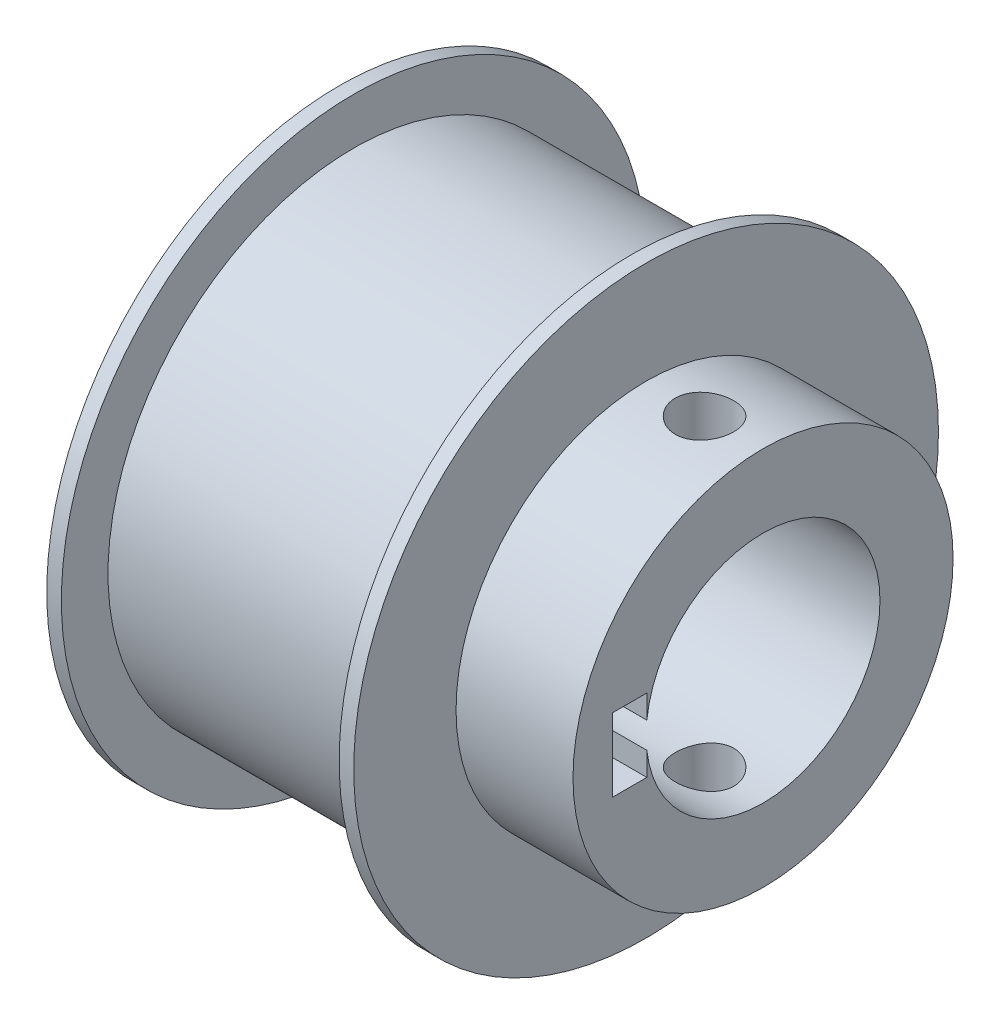
ISO-10303-21;
HEADER;
FILE_DESCRIPTION(('STEP AP214'),'2;1');
FILE_NAME('part.step','',(''),(''),'','','');
FILE_SCHEMA(('AUTOMOTIVE_DESIGN { 1 0 10303 214 1 1 1 1 }'));
ENDSEC;
DATA;
#1=APPLICATION_CONTEXT('core data for automotive mechanical design processes');
#2=APPLICATION_PROTOCOL_DEFINITION('international standard','automotive_design',2000,#1);
#3=PRODUCT_CONTEXT('',#1,'mechanical');
#4=PRODUCT('Part','Part','',(#3));
#5=PRODUCT_RELATED_PRODUCT_CATEGORY('part','',(#4));
#6=PRODUCT_DEFINITION_FORMATION('','',#4);
#7=PRODUCT_DEFINITION_CONTEXT('part definition',#1,'design');
#8=PRODUCT_DEFINITION('design','',#6,#7);
#9=PRODUCT_DEFINITION_SHAPE('','',#8);
#10=(LENGTH_UNIT() NAMED_UNIT(*) SI_UNIT(.MILLI.,.METRE.));
#11=(NAMED_UNIT(*) PLANE_ANGLE_UNIT() SI_UNIT($,.RADIAN.));
#12=(NAMED_UNIT(*) SI_UNIT($,.STERADIAN.) SOLID_ANGLE_UNIT());
#13=UNCERTAINTY_MEASURE_WITH_UNIT(LENGTH_MEASURE(1.E-05),#10,'distance_accuracy_value','');
#14=(GEOMETRIC_REPRESENTATION_CONTEXT(3) GLOBAL_UNCERTAINTY_ASSIGNED_CONTEXT((#13)) GLOBAL_UNIT_ASSIGNED_CONTEXT((#10,
#11,#12)) REPRESENTATION_CONTEXT('',''));
#15=CARTESIAN_POINT('',(0.,0.,0.));
#16=DIRECTION('',(0.,0.,1.));
#17=DIRECTION('',(1.,0.,0.));
#18=AXIS2_PLACEMENT_3D('',#15,#16,#17);
#19=CARTESIAN_POINT('',(0.014,17.514,27.964));
#20=DIRECTION('',(0.,0.,1.));
#21=DIRECTION('',(1.,0.,0.));
#22=AXIS2_PLACEMENT_3D('',#19,#20,#21);
#23=PLANE('',#22);
#24=DIRECTION('',(0.,1.,0.));
#25=VECTOR('',#24,1.);
#26=CARTESIAN_POINT('',(29.014,20.014,27.964));
#27=LINE('',#26,#25);
#28=CARTESIAN_POINT('',(29.014,19.1209714450257,27.964));
#29=VERTEX_POINT('',#28);
#30=CARTESIAN_POINT('',(29.014,17.514,27.964));
#31=VERTEX_POINT('',#30);
#32=EDGE_CURVE('E79',#29,#31,#27,.F.);
#33=ORIENTED_EDGE('',*,*,#32,.F.);
#34=DIRECTION('',(1.,0.,0.));
#35=VECTOR('',#34,1.);
#36=CARTESIAN_POINT('',(0.014,19.120971445025,27.964));
#37=LINE('',#36,#35);
#38=CARTESIAN_POINT('',(0.014,19.1209714450252,27.964));
#39=VERTEX_POINT('',#38);
#40=EDGE_CURVE('E58',#29,#39,#37,.F.);
#41=ORIENTED_EDGE('',*,*,#40,.T.);
#42=DIRECTION('',(0.,1.,0.));
#43=VECTOR('',#42,1.);
#44=CARTESIAN_POINT('',(0.014,17.514,27.964));
#45=LINE('',#44,#43);
#46=CARTESIAN_POINT('',(0.014,17.514,27.964));
#47=VERTEX_POINT('',#46);
#48=EDGE_CURVE('E97',#39,#47,#45,.F.);
#49=ORIENTED_EDGE('',*,*,#48,.T.);
#50=DIRECTION('',(1.,0.,0.));
#51=VECTOR('',#50,1.);
#52=CARTESIAN_POINT('',(0.014,17.514,27.964));
#53=LINE('',#52,#51);
#54=EDGE_CURVE('E114',#31,#47,#53,.F.);
#55=ORIENTED_EDGE('',*,*,#54,.F.);
#56=EDGE_LOOP('',(#33,#41,#49,#55));
#57=FACE_BOUND('',#56,.T.);
#58=ADVANCED_FACE('F16',(#57),#23,.T.);
#59=CARTESIAN_POINT('',(0.014,17.514,27.964));
#60=DIRECTION('',(0.,0.,1.));
#61=DIRECTION('',(1.,0.,0.));
#62=AXIS2_PLACEMENT_3D('',#59,#60,#61);
#63=PLANE('',#62);
#64=DIRECTION('',(0.,1.,0.));
#65=VECTOR('',#64,1.);
#66=CARTESIAN_POINT('',(29.014,20.014,27.964));
#67=LINE('',#66,#65);
#68=CARTESIAN_POINT('',(29.014,22.514,27.964));
#69=VERTEX_POINT('',#68);
#70=CARTESIAN_POINT('',(29.014,20.9070285549748,27.964));
#71=VERTEX_POINT('',#70);
#72=EDGE_CURVE('E70',#69,#71,#67,.F.);
#73=ORIENTED_EDGE('',*,*,#72,.F.);
#74=DIRECTION('',(1.,0.,0.));
#75=VECTOR('',#74,1.);
#76=CARTESIAN_POINT('',(0.014,22.514,27.964));
#77=LINE('',#76,#75);
#78=CARTESIAN_POINT('',(0.014,22.514,27.964));
#79=VERTEX_POINT('',#78);
#80=EDGE_CURVE('E109',#69,#79,#77,.F.);
#81=ORIENTED_EDGE('',*,*,#80,.T.);
#82=DIRECTION('',(0.,1.,0.));
#83=VECTOR('',#82,1.);
#84=CARTESIAN_POINT('',(0.014,17.514,27.964));
#85=LINE('',#84,#83);
#86=CARTESIAN_POINT('',(0.014,20.9070285549738,27.9640000000001));
#87=VERTEX_POINT('',#86);
#88=EDGE_CURVE('E35',#79,#87,#85,.F.);
#89=ORIENTED_EDGE('',*,*,#88,.T.);
#90=DIRECTION('',(1.,0.,0.));
#91=VECTOR('',#90,1.);
#92=CARTESIAN_POINT('',(0.014,20.907028554973,27.9640000000002));
#93=LINE('',#92,#91);
#94=EDGE_CURVE('E66',#87,#71,#93,.T.);
#95=ORIENTED_EDGE('',*,*,#94,.T.);
#96=EDGE_LOOP('',(#73,#81,#89,#95));
#97=FACE_BOUND('',#96,.T.);
#98=ADVANCED_FACE('F67',(#97),#63,.T.);
#99=CARTESIAN_POINT('',(29.014,20.014,20.014));
#100=DIRECTION('',(1.,0.,0.));
#101=DIRECTION('',(0.,0.,-1.));
#102=AXIS2_PLACEMENT_3D('',#99,#100,#101);
#103=PLANE('',#102);
#104=DIRECTION('',(0.,0.,1.));
#105=VECTOR('',#104,1.);
#106=CARTESIAN_POINT('',(29.014,22.514,27.964));
#107=LINE('',#106,#105);
#108=CARTESIAN_POINT('',(29.014,22.514,30.314));
#109=VERTEX_POINT('',#108);
#110=EDGE_CURVE('E84',#109,#69,#107,.F.);
#111=ORIENTED_EDGE('',*,*,#110,.T.);
#112=ORIENTED_EDGE('',*,*,#72,.T.);
#113=CARTESIAN_POINT('',(29.014,20.014,20.014));
#114=DIRECTION('',(1.,0.,0.));
#115=DIRECTION('',(0.,0.,-1.));
#116=AXIS2_PLACEMENT_3D('',#113,#114,#115);
#117=CIRCLE('',#116,8.);
#118=EDGE_CURVE('E20',#71,#29,#117,.F.);
#119=ORIENTED_EDGE('',*,*,#118,.T.);
#120=ORIENTED_EDGE('',*,*,#32,.T.);
#121=DIRECTION('',(0.,0.,1.));
#122=VECTOR('',#121,1.);
#123=CARTESIAN_POINT('',(29.014,17.514,27.964));
#124=LINE('',#123,#122);
#125=CARTESIAN_POINT('',(29.014,17.514,30.314));
#126=VERTEX_POINT('',#125);
#127=EDGE_CURVE('E117',#126,#31,#124,.F.);
#128=ORIENTED_EDGE('',*,*,#127,.F.);
#129=DIRECTION('',(0.,1.,0.));
#130=VECTOR('',#129,1.);
#131=CARTESIAN_POINT('',(29.014,17.514,30.314));
#132=LINE('',#131,#130);
#133=EDGE_CURVE('E111',#126,#109,#132,.T.);
#134=ORIENTED_EDGE('',*,*,#133,.T.);
#135=EDGE_LOOP('',(#111,#112,#119,#120,#128,#134));
#136=FACE_BOUND('',#135,.T.);
#137=CARTESIAN_POINT('',(29.014,20.014,20.014));
#138=DIRECTION('',(1.,0.,0.));
#139=DIRECTION('',(0.,0.,-1.));
#140=AXIS2_PLACEMENT_3D('',#137,#138,#139);
#141=CIRCLE('',#140,13.);
#142=CARTESIAN_POINT('',(29.014,20.014,7.014));
#143=VERTEX_POINT('',#142);
#144=EDGE_CURVE('E105',#143,#143,#141,.F.);
#145=ORIENTED_EDGE('',*,*,#144,.F.);
#146=EDGE_LOOP('',(#145));
#147=FACE_BOUND('',#146,.T.);
#148=ADVANCED_FACE('F80',(#136,#147),#103,.T.);
#149=CARTESIAN_POINT('',(25.014,33.014,20.014));
#150=DIRECTION('',(0.,-1.,0.));
#151=DIRECTION('',(0.,0.,-1.));
#152=AXIS2_PLACEMENT_3D('',#149,#150,#151);
#153=CYLINDRICAL_SURFACE('',#152,2.);
#154=CARTESIAN_POINT('',(27.0140000416667,33.0140000416667,20.014));
#155=CARTESIAN_POINT('',(27.0139950115,33.0139981262623,20.1255273037603));
#156=CARTESIAN_POINT('',(27.0046319758743,33.0125486004977,20.2371981854701));
#157=CARTESIAN_POINT('',(26.967416237804,33.0069022317644,20.4574980159759));
#158=CARTESIAN_POINT('',(26.9395256947534,33.0026997664324,20.5661202640384));
#159=CARTESIAN_POINT('',(26.8661068542264,32.9920194652457,20.7769813903583));
#160=CARTESIAN_POINT('',(26.8205994740745,32.9855443286916,20.8792276725657));
#161=CARTESIAN_POINT('',(26.713285753223,32.9710351005288,21.0745887182655));
#162=CARTESIAN_POINT('',(26.6514857217176,32.9630016126962,21.1677069973945));
#163=CARTESIAN_POINT('',(26.5127883361127,32.9461926198241,21.3429902654713));
#164=CARTESIAN_POINT('',(26.435782127367,32.937412040992,21.4250686497853));
#165=CARTESIAN_POINT('',(26.2690890889964,32.9201376942507,21.5751965623571));
#166=CARTESIAN_POINT('',(26.1794008686756,32.9116439579231,21.6432445500419));
#167=CARTESIAN_POINT('',(25.989317860327,32.8958571349,21.7637084897802));
#168=CARTESIAN_POINT('',(25.8888700546251,32.8885704907595,21.8160417018071));
#169=CARTESIAN_POINT('',(25.6804801816044,32.8760913084053,21.903061039858));
#170=CARTESIAN_POINT('',(25.5725386098794,32.8708986318633,21.9377483316181));
#171=CARTESIAN_POINT('',(25.3531243035705,32.8632445609469,21.9882257685563));
#172=CARTESIAN_POINT('',(25.2416860226075,32.860762004246,22.004162407963));
#173=CARTESIAN_POINT('',(25.0176912618173,32.8587450648571,22.0171400539628));
#174=CARTESIAN_POINT('',(24.9051348479891,32.8592105091805,22.0141821692862));
#175=CARTESIAN_POINT('',(24.6831373627152,32.8630176306083,21.9895744135792));
#176=CARTESIAN_POINT('',(24.5736776585285,32.8663341274423,21.968088178316));
#177=CARTESIAN_POINT('',(24.3599347996823,32.8754303598459,21.9072896181141));
#178=CARTESIAN_POINT('',(24.2556518420732,32.8812101891009,21.8679766151845));
#179=CARTESIAN_POINT('',(24.0547243508733,32.8946097431793,21.7724697411699));
#180=CARTESIAN_POINT('',(23.9581134054256,32.90223702355,21.716206311179));
#181=CARTESIAN_POINT('',(23.7756494776341,32.9184658973521,21.5884499190713));
#182=CARTESIAN_POINT('',(23.6897963936178,32.9270674815739,21.5169571009046));
#183=CARTESIAN_POINT('',(23.530343506167,32.9443857977198,21.3598888034238));
#184=CARTESIAN_POINT('',(23.4568796503506,32.9531028003158,21.2741752905057));
#185=CARTESIAN_POINT('',(23.3253249632562,32.9695913990116,21.0915185108495));
#186=CARTESIAN_POINT('',(23.2672410610363,32.9773625681403,20.994570210737));
#187=CARTESIAN_POINT('',(23.1680921975812,32.9910933700786,20.7920501961293));
#188=CARTESIAN_POINT('',(23.1270520185102,32.9970503616806,20.686466189973));
#189=CARTESIAN_POINT('',(23.0634076189869,33.0064518685837,20.4699327276271));
#190=CARTESIAN_POINT('',(23.0407644786679,33.0099016862971,20.3589951271221));
#191=CARTESIAN_POINT('',(23.0230866769247,33.0126047645657,20.2083905467064));
#192=CARTESIAN_POINT('',(23.0196818598663,33.013126880972,20.1695973515553));
#193=CARTESIAN_POINT('',(23.0151376366844,33.0138248389177,20.0918752739758));
#194=CARTESIAN_POINT('',(23.0139982320686,33.0140006802267,20.0529463914571));
#195=CARTESIAN_POINT('',(23.0140050626674,33.0139980520956,19.9024726930908));
#196=CARTESIAN_POINT('',(23.0233680446544,33.012548580508,19.7908018082157));
#197=CARTESIAN_POINT('',(23.0605837437676,33.00690225147,19.5705019776749));
#198=CARTESIAN_POINT('',(23.0884743009788,33.0026997716138,19.4618797326302));
#199=CARTESIAN_POINT('',(23.1618931509685,32.9920194599349,19.2510186102919));
#200=CARTESIAN_POINT('',(23.2074005266429,32.9855443273652,19.1487723291194));
#201=CARTESIAN_POINT('',(23.314714244477,32.9710351020687,18.9534112829315));
#202=CARTESIAN_POINT('',(23.3765142778538,32.9630016130804,18.8602930025097));
#203=CARTESIAN_POINT('',(23.515211665704,32.9461926192693,18.6850097328749));
#204=CARTESIAN_POINT('',(23.5922178746924,32.9374120406695,18.6029313481988));
#205=CARTESIAN_POINT('',(23.7589109131149,32.920137694141,18.4528034359026));
#206=CARTESIAN_POINT('',(23.8485991331078,32.9116439577906,18.3847554487034));
#207=CARTESIAN_POINT('',(24.0386821409298,32.8958571347799,18.2642915095485));
#208=CARTESIAN_POINT('',(24.1391299464698,32.8885704906793,18.2119582976774));
#209=CARTESIAN_POINT('',(24.3475198195195,32.8760913083526,18.1249389597309));
#210=CARTESIAN_POINT('',(24.4554613914616,32.8708986318052,18.0902516679804));
#211=CARTESIAN_POINT('',(24.6748756980311,32.8632445609022,18.0397742311675));
#212=CARTESIAN_POINT('',(24.7863139790313,32.8607620042161,18.0238375918482));
#213=CARTESIAN_POINT('',(25.0103087398253,32.8587450648575,18.0108599460359));
#214=CARTESIAN_POINT('',(25.1228651536195,32.8592105091949,18.0138178308031));
#215=CARTESIAN_POINT('',(25.3448626389302,32.8630176306496,18.0384255866914));
#216=CARTESIAN_POINT('',(25.4543223431857,32.8663341274997,18.0599118220655));
#217=CARTESIAN_POINT('',(25.6680652019752,32.8754303599321,18.1207103824635));
#218=CARTESIAN_POINT('',(25.7723481594673,32.8812101891958,18.1600233854497));
#219=CARTESIAN_POINT('',(25.973275650203,32.8946097432589,18.2555302594402));
#220=CARTESIAN_POINT('',(26.069886595321,32.9022370236015,18.3117936893139));
#221=CARTESIAN_POINT('',(26.2523505231048,32.9184658974327,18.4395500814758));
#222=CARTESIAN_POINT('',(26.3382036073787,32.9270674817176,18.5110428999051));
#223=CARTESIAN_POINT('',(26.4976564955004,32.9443857978651,18.6681111983923));
#224=CARTESIAN_POINT('',(26.5711203516597,32.953102800398,18.7538247121238));
#225=CARTESIAN_POINT('',(26.7026750387229,32.9695913994295,18.93648149206));
#226=CARTESIAN_POINT('',(26.7607589408178,32.9773625689727,19.0334297914585));
#227=CARTESIAN_POINT('',(26.8599078017029,32.9910933694031,19.2359498040026));
#228=CARTESIAN_POINT('',(26.9009479784176,32.9970503590892,19.3415338087636));
#229=CARTESIAN_POINT('',(26.9645923832684,33.0064518710499,19.5580672708773));
#230=CARTESIAN_POINT('',(26.987235530762,33.0099016956512,19.6690048726953));
#231=CARTESIAN_POINT('',(27.0049133200377,33.0126047613673,19.8196094552374));
#232=CARTESIAN_POINT('',(27.0083181319272,33.0131268726133,19.8584026508055));
#233=CARTESIAN_POINT('',(27.0128623717686,33.0138248473142,19.9361247278781));
#234=CARTESIAN_POINT('',(27.0140017982485,33.014000710544,19.9750536094708));
#235=CARTESIAN_POINT('',(27.0140000416667,33.0140000416667,20.014));
#236=B_SPLINE_CURVE_WITH_KNOTS('',3,(#154,#155,#156,#157,#158,#159,#160,#161,#162,#163,#164,
#165,#166,#167,#168,#169,#170,#171,#172,#173,#174,#175,#176,#177,#178,#179,#180,#181,#182,#183,
#184,#185,#186,#187,#188,#189,#190,#191,#192,#193,#194,#195,#196,#197,#198,#199,#200,#201,#202,
#203,#204,#205,#206,#207,#208,#209,#210,#211,#212,#213,#214,#215,#216,#217,#218,#219,#220,#221,
#222,#223,#224,#225,#226,#227,#228,#229,#230,#231,#232,#233,#234,#235),.UNSPECIFIED.,.T.,.F.,(4,
2,2,2,2,2,2,2,2,2,2,2,2,2,2,2,2,2,2,2,2,2,2,2,2,2,2,2,2,2,2,2,2,2,2,2,2,2,2,2,4),(0.,
0.334433336554248,0.669551828931188,1.00427363329828,1.3388660093271,1.67594660617867,
2.01306419564025,2.35192682002691,2.69076705534331,3.02694205620429,3.36309733050424,
3.69631385696467,4.02954305744271,4.36415878991411,4.69877135969541,5.03684548499304,
5.37507166307866,5.71378792628709,6.05178573847991,6.1685729496577,6.28536023855719,
6.61979357948793,6.95491206426401,7.28963386478933,7.62422624544979,7.96130684413231,
8.29842443177513,8.63728705557362,8.97612729147528,9.31230229241224,9.64845756661777,
9.98167409334363,10.3149032935513,10.6495190250287,10.98413159582,11.3222057238526,
11.6604318992155,11.9991481578886,12.3371459746061,12.4539331866114,12.5707204744977),.UNSPECIFIED.);
#237=CARTESIAN_POINT('',(27.0140000416667,33.0140000416667,20.014));
#238=VERTEX_POINT('',#237);
#239=EDGE_CURVE('E163',#238,#238,#236,.T.);
#240=ORIENTED_EDGE('',*,*,#239,.F.);
#241=EDGE_LOOP('',(#240));
#242=FACE_BOUND('',#241,.T.);
#243=CARTESIAN_POINT('',(27.014,28.014,20.014));
#244=CARTESIAN_POINT('',(27.0139943551092,28.0139967232233,19.9036265058065));
#245=CARTESIAN_POINT('',(27.0048228022313,28.0116904338893,19.7931232140391));
#246=CARTESIAN_POINT('',(26.968403069722,28.0027040073668,19.5751852357951));
#247=CARTESIAN_POINT('',(26.9411208560528,27.9960156355606,19.4677567247731));
#248=CARTESIAN_POINT('',(26.8694088873548,27.9790070093234,19.2592940848464));
#249=CARTESIAN_POINT('',(26.8250085240754,27.968692982781,19.1582493392886));
#250=CARTESIAN_POINT('',(26.7204072322132,27.9455341840969,18.965075781654));
#251=CARTESIAN_POINT('',(26.6602103883455,27.9326900664097,18.8729446730716));
#252=CARTESIAN_POINT('',(26.5244008259397,27.905565884715,18.6982668233512));
#253=CARTESIAN_POINT('',(26.4485220705619,27.891263546403,18.6159303508182));
#254=CARTESIAN_POINT('',(26.2840685910166,27.862982371055,18.4650051174588));
#255=CARTESIAN_POINT('',(26.1954917412094,27.8490035886375,18.396418662982));
#256=CARTESIAN_POINT('',(26.0065393237289,27.8227302901337,18.2739643886937));
#257=CARTESIAN_POINT('',(25.9060082417738,27.8104638306106,18.2203299667376));
#258=CARTESIAN_POINT('',(25.6970012748183,27.7893265285306,18.1308038371054));
#259=CARTESIAN_POINT('',(25.588526725028,27.7804551168569,18.0949091553972));
#260=CARTESIAN_POINT('',(25.3690087356128,27.7673396932728,18.0425935681706));
#261=CARTESIAN_POINT('',(25.2580602740414,27.7630065518464,18.0257969957999));
#262=CARTESIAN_POINT('',(25.0348420445204,27.7591914988918,18.0109842977197));
#263=CARTESIAN_POINT('',(24.9225724928555,27.759708804003,18.0129651394058));
#264=CARTESIAN_POINT('',(24.7027792808956,27.7654560641484,18.0353512620788));
#265=CARTESIAN_POINT('',(24.5952065484016,27.7705714728833,18.0553087406261));
#266=CARTESIAN_POINT('',(24.3849859446402,27.7847560689353,18.1123675127474));
#267=CARTESIAN_POINT('',(24.2823384573448,27.7938255639587,18.1494701405674));
#268=CARTESIAN_POINT('',(24.083679299873,27.8150018759886,18.2401488629789));
#269=CARTESIAN_POINT('',(23.9877453394808,27.8271385158416,18.293887946315));
#270=CARTESIAN_POINT('',(23.8061026143021,27.8530637372651,18.4161963472254));
#271=CARTESIAN_POINT('',(23.72039495625,27.866852497312,18.48476726771));
#272=CARTESIAN_POINT('',(23.5590782019942,27.8950088932488,18.6370996069856));
#273=CARTESIAN_POINT('',(23.483824192049,27.9093818591952,18.721236494027));
#274=CARTESIAN_POINT('',(23.348395671491,27.936740996237,18.9011473024731));
#275=CARTESIAN_POINT('',(23.2882276476748,27.9497265693972,18.9969262036146));
#276=CARTESIAN_POINT('',(23.1845501103733,27.9729141964943,19.1979357541348));
#277=CARTESIAN_POINT('',(23.1411114496638,27.9831043599643,19.303204323475));
#278=CARTESIAN_POINT('',(23.0727276118664,27.9994505931434,19.5197328167494));
#279=CARTESIAN_POINT('',(23.0477439144675,28.0056150623863,19.6309797383203));
#280=CARTESIAN_POINT('',(23.0262606388046,28.0109422052241,19.7882853685857));
#281=CARTESIAN_POINT('',(23.0216673432076,28.0120860551192,19.8332913577974));
#282=CARTESIAN_POINT('',(23.0155358630925,28.0136156250803,19.923524292738));
#283=CARTESIAN_POINT('',(23.0139976858183,28.0140013433487,19.9687512389906));
#284=CARTESIAN_POINT('',(23.0140056448908,28.0139967232233,20.1243734941935));
#285=CARTESIAN_POINT('',(23.0231771977687,28.0116904338893,20.2348767859609));
#286=CARTESIAN_POINT('',(23.059596930278,28.0027040073668,20.4528147642049));
#287=CARTESIAN_POINT('',(23.0868791439473,27.9960156355606,20.560243275227));
#288=CARTESIAN_POINT('',(23.1585911126452,27.9790070093234,20.7687059151536));
#289=CARTESIAN_POINT('',(23.2029914759246,27.968692982781,20.8697506607114));
#290=CARTESIAN_POINT('',(23.3075927677868,27.9455341840969,21.062924218346));
#291=CARTESIAN_POINT('',(23.3677896116545,27.9326900664097,21.1550553269284));
#292=CARTESIAN_POINT('',(23.5035991740603,27.905565884715,21.3297331766488));
#293=CARTESIAN_POINT('',(23.5794779294381,27.891263546403,21.4120696491818));
#294=CARTESIAN_POINT('',(23.7439314089834,27.862982371055,21.5629948825412));
#295=CARTESIAN_POINT('',(23.8325082587906,27.8490035886375,21.631581337018));
#296=CARTESIAN_POINT('',(24.0214606762712,27.8227302901337,21.7540356113063));
#297=CARTESIAN_POINT('',(24.1219917582263,27.8104638306106,21.8076700332624));
#298=CARTESIAN_POINT('',(24.3309987251817,27.7893265285306,21.8971961628946));
#299=CARTESIAN_POINT('',(24.4394732749721,27.7804551168569,21.9330908446028));
#300=CARTESIAN_POINT('',(24.6589912643872,27.7673396932728,21.9854064318294));
#301=CARTESIAN_POINT('',(24.7699397259586,27.7630065518464,22.0022030042001));
#302=CARTESIAN_POINT('',(24.9931579554796,27.7591914988918,22.0170157022803));
#303=CARTESIAN_POINT('',(25.1054275071445,27.759708804003,22.0150348605942));
#304=CARTESIAN_POINT('',(25.3252207191044,27.7654560641484,21.9926487379212));
#305=CARTESIAN_POINT('',(25.4327934515984,27.7705714728833,21.9726912593738));
#306=CARTESIAN_POINT('',(25.6430140553598,27.7847560689353,21.9156324872526));
#307=CARTESIAN_POINT('',(25.7456615426552,27.7938255639587,21.8785298594326));
#308=CARTESIAN_POINT('',(25.944320700127,27.8150018759886,21.7878511370211));
#309=CARTESIAN_POINT('',(26.0402546605192,27.8271385158416,21.734112053685));
#310=CARTESIAN_POINT('',(26.2218973856979,27.8530637372651,21.6118036527746));
#311=CARTESIAN_POINT('',(26.3076050437501,27.866852497312,21.54323273229));
#312=CARTESIAN_POINT('',(26.4689217980058,27.8950088932488,21.3909003930144));
#313=CARTESIAN_POINT('',(26.544175807951,27.9093818591952,21.306763505973));
#314=CARTESIAN_POINT('',(26.679604328509,27.936740996237,21.1268526975269));
#315=CARTESIAN_POINT('',(26.7397723523252,27.9497265693972,21.0310737963854));
#316=CARTESIAN_POINT('',(26.8434498896267,27.9729141964943,20.8300642458652));
#317=CARTESIAN_POINT('',(26.8868885503362,27.9831043599643,20.724795676525));
#318=CARTESIAN_POINT('',(26.9552723881336,27.9994505931434,20.5082671832506));
#319=CARTESIAN_POINT('',(26.9802560855325,28.0056150623863,20.3970202616797));
#320=CARTESIAN_POINT('',(27.0017393611955,28.0109422052241,20.2397146314143));
#321=CARTESIAN_POINT('',(27.0063326567925,28.0120860551192,20.1947086422026));
#322=CARTESIAN_POINT('',(27.0124641369075,28.0136156250803,20.104475707262));
#323=CARTESIAN_POINT('',(27.0140023141817,28.0140013433487,20.0592487610094));
#324=CARTESIAN_POINT('',(27.014,28.014,20.014));
#325=B_SPLINE_CURVE_WITH_KNOTS('',3,(#243,#244,#245,#246,#247,#248,#249,#250,#251,#252,#253,
#254,#255,#256,#257,#258,#259,#260,#261,#262,#263,#264,#265,#266,#267,#268,#269,#270,#271,#272,
#273,#274,#275,#276,#277,#278,#279,#280,#281,#282,#283,#284,#285,#286,#287,#288,#289,#290,#291,
#292,#293,#294,#295,#296,#297,#298,#299,#300,#301,#302,#303,#304,#305,#306,#307,#308,#309,#310,
#311,#312,#313,#314,#315,#316,#317,#318,#319,#320,#321,#322,#323,#324),.UNSPECIFIED.,.T.,.F.,(4,
2,2,2,2,2,2,2,2,2,2,2,2,2,2,2,2,2,2,2,2,2,2,2,2,2,2,2,2,2,2,2,2,2,2,2,2,2,2,2,4),(0.,
0.330946983045439,0.662517657801357,0.993521545220029,1.32443992457115,1.66151658222464,
1.99864973197669,2.34078329803452,2.68285948660786,3.01808373561038,3.35325384589237,
3.68029888738367,4.00736938400806,4.33775143805342,4.66816921509436,5.00795227856435,
5.34788119516374,5.68923436048329,6.02987300392473,6.16554783732439,6.30122299241518,
6.63216997546062,6.96374065021654,7.29474453763522,7.62566291698633,7.96273957463983,
8.29987272439187,8.64200629044971,8.98408247902305,9.31930672802557,9.65447683830756,
9.98152187979886,10.3085923764233,10.6389744304686,10.9693922075095,11.3091752709795,
11.6491041875789,11.9904573528985,12.3310959963399,12.4667708297396,12.6024459848304),.UNSPECIFIED.);
#326=CARTESIAN_POINT('',(27.014,28.014,20.014));
#327=VERTEX_POINT('',#326);
#328=EDGE_CURVE('E86',#327,#327,#325,.T.);
#329=ORIENTED_EDGE('',*,*,#328,.F.);
#330=EDGE_LOOP('',(#329));
#331=FACE_BOUND('',#330,.T.);
#332=ADVANCED_FACE('F197',(#242,#331),#153,.F.);
#333=CARTESIAN_POINT('',(25.014,7.014,20.014));
#334=DIRECTION('',(0.,1.,0.));
#335=DIRECTION('',(0.,0.,1.));
#336=AXIS2_PLACEMENT_3D('',#333,#334,#335);
#337=CYLINDRICAL_SURFACE('',#336,2.);
#338=CARTESIAN_POINT('',(27.014,7.014,20.014));
#339=CARTESIAN_POINT('',(27.0139949373326,7.01400194790439,19.9024726930914));
#340=CARTESIAN_POINT('',(27.0046319553457,7.01545141949203,19.7908018082165));
#341=CARTESIAN_POINT('',(26.9674162562326,7.02109774852996,19.5705019776756));
#342=CARTESIAN_POINT('',(26.9395256990213,7.02530022838617,19.4618797326305));
#343=CARTESIAN_POINT('',(26.8661068490316,7.03598054006513,19.2510186102921));
#344=CARTESIAN_POINT('',(26.8205994733573,7.04245567263476,19.1487723291197));
#345=CARTESIAN_POINT('',(26.7132857555231,7.05696489793124,18.9534112829318));
#346=CARTESIAN_POINT('',(26.6514857221463,7.06499838691961,18.8602930025099));
#347=CARTESIAN_POINT('',(26.5127883342951,7.08180738073082,18.6850097328738));
#348=CARTESIAN_POINT('',(26.4357821253056,7.0905879593307,18.6029313481967));
#349=CARTESIAN_POINT('',(26.2690890868829,7.10786230585923,18.4528034359009));
#350=CARTESIAN_POINT('',(26.179400866891,7.11635604220948,18.3847554487026));
#351=CARTESIAN_POINT('',(25.989317859076,7.13214286521964,18.2642915095521));
#352=CARTESIAN_POINT('',(25.8888700535424,7.13942950931977,18.2119582976837));
#353=CARTESIAN_POINT('',(25.6804801804936,7.15190869164681,18.1249389597351));
#354=CARTESIAN_POINT('',(25.5725386085451,7.15710136819456,18.090251667982));
#355=CARTESIAN_POINT('',(25.3531243019413,7.16475543909871,18.0397742311611));
#356=CARTESIAN_POINT('',(25.2416860209124,7.1672379957851,18.0238375918401));
#357=CARTESIAN_POINT('',(25.0176912601179,7.16925493514238,18.0108599460374));
#358=CARTESIAN_POINT('',(24.9051348463525,7.1687894908049,18.0138178308062));
#359=CARTESIAN_POINT('',(24.6831373611726,7.16498236935192,18.03842558668));
#360=CARTESIAN_POINT('',(24.5736776570177,7.16166587250565,18.0599118220253));
#361=CARTESIAN_POINT('',(24.3599347982206,7.15256964007962,18.1207103823901));
#362=CARTESIAN_POINT('',(24.25565184063,7.14678981081381,18.1600233854051));
#363=CARTESIAN_POINT('',(24.0547243494887,7.13339025671734,18.2555302595851));
#364=CARTESIAN_POINT('',(23.9581134040806,7.1257629763395,18.3117936896549));
#365=CARTESIAN_POINT('',(23.7756494763866,7.10953410252784,18.4395500819099));
#366=CARTESIAN_POINT('',(23.6897963924275,7.10093251830367,18.5110429001442));
#367=CARTESIAN_POINT('',(23.5303435051005,7.08361420215748,18.6681111977517));
#368=CARTESIAN_POINT('',(23.456879649351,7.07489719956352,18.7538247107292));
#369=CARTESIAN_POINT('',(23.3253249623989,7.05840860087631,18.9364814904937));
#370=CARTESIAN_POINT('',(23.2672410602546,7.05063743175401,19.0334297906553));
#371=CARTESIAN_POINT('',(23.1680921969601,7.03690662983276,19.2359498053444));
#372=CARTESIAN_POINT('',(23.1270520179736,7.03094963824123,19.3415338115327));
#373=CARTESIAN_POINT('',(23.0634076186237,7.02154813136154,19.5580672739271));
#374=CARTESIAN_POINT('',(23.0407644783934,7.01809831366113,19.6690048744486));
#375=CARTESIAN_POINT('',(23.0230866768011,7.01539523541536,19.8196094546129));
#376=CARTESIAN_POINT('',(23.019681859789,7.01487311901618,19.8584026495018));
#377=CARTESIAN_POINT('',(23.0151376366689,7.01417516107995,19.9361247265543));
#378=CARTESIAN_POINT('',(23.0139982320686,7.01399931977335,19.975053608808));
#379=CARTESIAN_POINT('',(23.0140050626674,7.01400194790439,20.1255273069086));
#380=CARTESIAN_POINT('',(23.0233680446543,7.01545141949203,20.2371981917835));
#381=CARTESIAN_POINT('',(23.0605837437674,7.02109774852996,20.4574980223244));
#382=CARTESIAN_POINT('',(23.0884743009787,7.02530022838617,20.5661202673695));
#383=CARTESIAN_POINT('',(23.1618931509684,7.03598054006513,20.7769813897079));
#384=CARTESIAN_POINT('',(23.2074005266427,7.04245567263476,20.8792276708803));
#385=CARTESIAN_POINT('',(23.3147142444769,7.05696489793124,21.0745887170682));
#386=CARTESIAN_POINT('',(23.3765142778537,7.06499838691961,21.1677069974901));
#387=CARTESIAN_POINT('',(23.5152116657049,7.08180738073083,21.3429902671262));
#388=CARTESIAN_POINT('',(23.5922178746944,7.0905879593307,21.4250686518033));
#389=CARTESIAN_POINT('',(23.7589109131171,7.10786230585923,21.5751965640991));
#390=CARTESIAN_POINT('',(23.848599133109,7.11635604220948,21.6432445512974));
#391=CARTESIAN_POINT('',(24.038682140924,7.13214286521964,21.7637084904479));
#392=CARTESIAN_POINT('',(24.1391299464576,7.13942950931977,21.8160417023163));
#393=CARTESIAN_POINT('',(24.3475198195064,7.15190869164681,21.9030610402649));
#394=CARTESIAN_POINT('',(24.4554613914549,7.15710136819456,21.937748332018));
#395=CARTESIAN_POINT('',(24.6748756980587,7.16475543909871,21.9882257688389));
#396=CARTESIAN_POINT('',(24.7863139790876,7.1672379957851,22.0041624081599));
#397=CARTESIAN_POINT('',(25.0103087398821,7.16925493514238,22.0171400539626));
#398=CARTESIAN_POINT('',(25.1228651536475,7.1687894908049,22.0141821691938));
#399=CARTESIAN_POINT('',(25.3448626388274,7.16498236935192,21.98957441332));
#400=CARTESIAN_POINT('',(25.4543223429823,7.16166587250565,21.9680881779747));
#401=CARTESIAN_POINT('',(25.6680652017794,7.15256964007962,21.9072896176099));
#402=CARTESIAN_POINT('',(25.77234815937,7.14678981081381,21.8679766145949));
#403=CARTESIAN_POINT('',(25.9732756505114,7.13339025671734,21.7724697404149));
#404=CARTESIAN_POINT('',(26.0698865959194,7.1257629763395,21.7162063103451));
#405=CARTESIAN_POINT('',(26.2523505236134,7.10953410252784,21.5884499180901));
#406=CARTESIAN_POINT('',(26.3382036075725,7.10093251830367,21.5169570998558));
#407=CARTESIAN_POINT('',(26.4976564948995,7.08361420215748,21.3598888022483));
#408=CARTESIAN_POINT('',(26.571120350649,7.07489719956352,21.2741752892708));
#409=CARTESIAN_POINT('',(26.7026750376011,7.05840860087631,21.0915185095063));
#410=CARTESIAN_POINT('',(26.7607589397455,7.05063743175401,20.9945702093447));
#411=CARTESIAN_POINT('',(26.8599078030399,7.03690662983276,20.7920501946556));
#412=CARTESIAN_POINT('',(26.9009479820264,7.03094963824123,20.6864661884673));
#413=CARTESIAN_POINT('',(26.9645923813763,7.02154813136154,20.4699327260729));
#414=CARTESIAN_POINT('',(26.9872355216066,7.01809831366113,20.3589951255514));
#415=CARTESIAN_POINT('',(27.0049133231989,7.01539523541536,20.2083905453871));
#416=CARTESIAN_POINT('',(27.008318140211,7.01487311901618,20.1695973504982));
#417=CARTESIAN_POINT('',(27.0128623633311,7.01417516107995,20.0918752734458));
#418=CARTESIAN_POINT('',(27.0140017679314,7.01399931977335,20.052946391192));
#419=CARTESIAN_POINT('',(27.014,7.014,20.014));
#420=B_SPLINE_CURVE_WITH_KNOTS('',3,(#338,#339,#340,#341,#342,#343,#344,#345,#346,#347,#348,
#349,#350,#351,#352,#353,#354,#355,#356,#357,#358,#359,#360,#361,#362,#363,#364,#365,#366,#367,
#368,#369,#370,#371,#372,#373,#374,#375,#376,#377,#378,#379,#380,#381,#382,#383,#384,#385,#386,
#387,#388,#389,#390,#391,#392,#393,#394,#395,#396,#397,#398,#399,#400,#401,#402,#403,#404,#405,
#406,#407,#408,#409,#410,#411,#412,#413,#414,#415,#416,#417,#418,#419),.UNSPECIFIED.,.T.,.F.,(4,
2,2,2,2,2,2,2,2,2,2,2,2,2,2,2,2,2,2,2,2,2,2,2,2,2,2,2,2,2,2,2,2,2,2,2,2,2,2,2,4),(0.,
0.334433340929669,0.669551825706819,1.00427362623168,1.3388660068926,1.67594660557934,
2.01306419321794,2.35192681699599,2.69076705291809,3.02694205393964,3.36309732806058,
3.69631385447636,4.02954305499409,4.36415878748303,4.69877135726278,5.03684548256442,
5.37507166065822,5.71378792386275,6.05178573604892,6.16857294643211,6.28536023453701,
6.61979357546668,6.95491206024383,7.28963386076869,7.62422624142961,7.96130684011635,
8.29842442775495,8.637287051533,8.9761272874551,9.31230228847664,9.64845756259759,
9.98167408901337,10.3149032895311,10.64951902202,10.9841315917998,11.3222057171014,
11.6604318951952,11.9991481583998,12.3371459705859,12.4539331809691,12.570720469074),.UNSPECIFIED.);
#421=CARTESIAN_POINT('',(27.014,7.014,20.014));
#422=VERTEX_POINT('',#421);
#423=EDGE_CURVE('E155',#422,#422,#420,.T.);
#424=ORIENTED_EDGE('',*,*,#423,.F.);
#425=EDGE_LOOP('',(#424));
#426=FACE_BOUND('',#425,.T.);
#427=CARTESIAN_POINT('',(27.014,12.014,20.014));
#428=CARTESIAN_POINT('',(27.0139968990158,12.0140018684265,20.1245014515596));
#429=CARTESIAN_POINT('',(27.0048112656349,12.0163122915757,20.2350375437744));
#430=CARTESIAN_POINT('',(26.968366464924,12.0253051489347,20.4529417650274));
#431=CARTESIAN_POINT('',(26.9410970539495,12.031990061067,20.5603080624943));
#432=CARTESIAN_POINT('',(26.8694143287172,12.0489916489062,20.7686944962434));
#433=CARTESIAN_POINT('',(26.825021601713,12.0593039621059,20.8697220845733));
#434=CARTESIAN_POINT('',(26.7204248132735,12.082462082565,21.0628961758726));
#435=CARTESIAN_POINT('',(26.660220218508,12.0953079752779,21.1550423791317));
#436=CARTESIAN_POINT('',(26.5243989471278,12.1224344854441,21.3297359030679));
#437=CARTESIAN_POINT('',(26.4485179000546,12.136737238025,21.4120742534147));
#438=CARTESIAN_POINT('',(26.284063726788,12.1650183984275,21.5629985696044));
#439=CARTESIAN_POINT('',(26.1954891694041,12.1789967694684,21.6315829825989));
#440=CARTESIAN_POINT('',(26.006539697684,12.2052696573578,21.7540353903986));
#441=CARTESIAN_POINT('',(25.9060090255884,12.2175360738025,21.8076696212335));
#442=CARTESIAN_POINT('',(25.6970021177866,12.2386734024264,21.8971958780677));
#443=CARTESIAN_POINT('',(25.5885271555573,12.2475448574078,21.9330907405869));
#444=CARTESIAN_POINT('',(25.3690086690645,12.2606603107157,21.985406449073));
#445=CARTESIAN_POINT('',(25.258060138616,12.2649934533732,22.0022030244427));
#446=CARTESIAN_POINT('',(25.0348419080009,12.2688085005388,22.0170157000885));
#447=CARTESIAN_POINT('',(24.9225724257438,12.2682911942943,22.0150348557575));
#448=CARTESIAN_POINT('',(24.7027789230062,12.2625439264424,21.9926486995196));
#449=CARTESIAN_POINT('',(24.5952058380462,12.2574284932361,21.9726911202542));
#450=CARTESIAN_POINT('',(24.3849852654519,12.2432438710524,21.915632249204));
#451=CARTESIAN_POINT('',(24.2823381292948,12.2341744004102,21.8785297360925));
#452=CARTESIAN_POINT('',(24.0836826449972,12.2129984812579,21.7878526372496));
#453=CARTESIAN_POINT('',(23.9877517709472,12.2008623004025,21.7341155563106));
#454=CARTESIAN_POINT('',(23.8061083869909,12.1749371887201,21.6118083680199));
#455=CARTESIAN_POINT('',(23.7203976692437,12.1611479688716,21.5432356650785));
#456=CARTESIAN_POINT('',(23.5590618457408,12.1329882594681,21.3908845662416));
#457=CARTESIAN_POINT('',(23.4837940132515,12.11861240696,21.3067283442211));
#458=CARTESIAN_POINT('',(23.3483716767148,12.0912537922833,21.1268158900049));
#459=CARTESIAN_POINT('',(23.2882176343152,12.0782710726746,21.0310593036106));
#460=CARTESIAN_POINT('',(23.1845992183675,12.0550969054108,20.8301545182419));
#461=CARTESIAN_POINT('',(23.1411928796608,12.044915198297,20.7249751909448));
#462=CARTESIAN_POINT('',(23.0727769257206,12.0285611067811,20.5085013441905));
#463=CARTESIAN_POINT('',(23.0477637914425,12.0223879554763,20.3972079988673));
#464=CARTESIAN_POINT('',(23.0173899125882,12.014860009715,20.17471996052));
#465=CARTESIAN_POINT('',(23.0115426318996,12.013385953223,20.063595626651));
#466=CARTESIAN_POINT('',(23.0183320027406,12.015082602474,19.8419561669313));
#467=CARTESIAN_POINT('',(23.0309669903988,12.0182528901087,19.7314409871405));
#468=CARTESIAN_POINT('',(23.0739612111885,12.0288055849686,19.5158476416313));
#469=CARTESIAN_POINT('',(23.1040550179693,12.0361248775225,19.4107131747083));
#470=CARTESIAN_POINT('',(23.1808094453713,12.0541505782115,19.20699027673));
#471=CARTESIAN_POINT('',(23.2274717390842,12.0648573284014,19.1084025079565));
#472=CARTESIAN_POINT('',(23.3369815051663,12.0887558943159,18.9186358207602));
#473=CARTESIAN_POINT('',(23.4001014831957,12.1019884351076,18.8276194108856));
#474=CARTESIAN_POINT('',(23.5403865450626,12.1294065441677,18.6572978484757));
#475=CARTESIAN_POINT('',(23.6175540528225,12.1435922766439,18.5779947213693));
#476=CARTESIAN_POINT('',(23.7860026144593,12.1717472405231,18.4313459092364));
#477=CARTESIAN_POINT('',(23.8775836040032,12.1857026108363,18.3643415098373));
#478=CARTESIAN_POINT('',(24.0709768459543,12.2114282883035,18.2466523213164));
#479=CARTESIAN_POINT('',(24.1727886439463,12.2231986924397,18.1959668077894));
#480=CARTESIAN_POINT('',(24.3832076298841,12.2430920702045,18.1127314391876));
#481=CARTESIAN_POINT('',(24.4917701711253,12.2512365961079,18.0800741377946));
#482=CARTESIAN_POINT('',(24.7130795171855,12.2629767454642,18.0335391200616));
#483=CARTESIAN_POINT('',(24.8258254013767,12.2665733637342,18.0196572966951));
#484=CARTESIAN_POINT('',(25.0488280318069,12.2687346506139,18.0112818795547));
#485=CARTESIAN_POINT('',(25.159063246833,12.2674408969565,18.0162428029598));
#486=CARTESIAN_POINT('',(25.3770718515573,12.2602945465621,18.0441636289162));
#487=CARTESIAN_POINT('',(25.4848452906849,12.2544420414419,18.067123169751));
#488=CARTESIAN_POINT('',(25.6942779454205,12.2389165242304,18.1300915740763));
#489=CARTESIAN_POINT('',(25.7959697403203,12.2292664635159,18.1699981270928));
#490=CARTESIAN_POINT('',(25.9912871769516,12.207229923669,18.2656467818599));
#491=CARTESIAN_POINT('',(26.0849116975826,12.1948430650564,18.3213910799544));
#492=CARTESIAN_POINT('',(26.2640728386694,12.1683248764865,18.4488430018171));
#493=CARTESIAN_POINT('',(26.3493347645653,12.1541564689099,18.520929116117));
#494=CARTESIAN_POINT('',(26.5067293930605,12.1258929700495,18.6782808384137));
#495=CARTESIAN_POINT('',(26.578858973484,12.1117978969725,18.7635495716518));
#496=CARTESIAN_POINT('',(26.7092150780861,12.0849645913645,18.9467098843965));
#497=CARTESIAN_POINT('',(26.7671661515621,12.0722555551218,19.0448021035782));
#498=CARTESIAN_POINT('',(26.8656632839207,12.0499343336651,19.249645253986));
#499=CARTESIAN_POINT('',(26.9062218141981,12.0403199306696,19.3563899154177));
#500=CARTESIAN_POINT('',(26.9627624404395,12.0266925391261,19.5547863290087));
#501=CARTESIAN_POINT('',(26.9819349907379,12.0219655326308,19.6454931054559));
#502=CARTESIAN_POINT('',(27.0075545914959,12.0156185969074,19.8287919046183));
#503=CARTESIAN_POINT('',(27.0140025990737,12.0139984339881,19.9213837850098));
#504=CARTESIAN_POINT('',(27.014,12.014,20.014));
#505=B_SPLINE_CURVE_WITH_KNOTS('',3,(#427,#428,#429,#430,#431,#432,#433,#434,#435,#436,#437,
#438,#439,#440,#441,#442,#443,#444,#445,#446,#447,#448,#449,#450,#451,#452,#453,#454,#455,#456,
#457,#458,#459,#460,#461,#462,#463,#464,#465,#466,#467,#468,#469,#470,#471,#472,#473,#474,#475,
#476,#477,#478,#479,#480,#481,#482,#483,#484,#485,#486,#487,#488,#489,#490,#491,#492,#493,#494,
#495,#496,#497,#498,#499,#500,#501,#502,#503,#504),.UNSPECIFIED.,.T.,.F.,(4,2,2,2,2,2,2,2,2,2,2,
2,2,2,2,2,2,2,2,2,2,2,2,2,2,2,2,2,2,2,2,2,2,2,2,2,2,2,4),(0.,0.33116494996252,0.662517650351865,
0.993473203048142,1.32443992022577,1.66152580582852,1.99864972773416,2.34078196727742,
2.68285948225824,3.01808393468093,3.3532538415469,3.68029996013785,4.00736937959145,
4.337740371696,4.66816921119311,5.00802001296453,5.34788119415423,5.68890972016579,
6.02987298255951,6.36211078603462,6.69431868154751,7.02160366023143,7.34892169767481,
7.68204783424897,8.01523150681786,8.35659345610395,8.69794025003771,9.03723006156476,
9.37644564340971,9.70591707202578,10.0353818794581,10.3628853408369,10.6904342418696,
11.0265276855097,11.3627009303165,11.7049624733721,12.0469781843289,12.3245632392729,
12.6021274139515),.UNSPECIFIED.);
#506=CARTESIAN_POINT('',(27.014,12.014,20.014));
#507=VERTEX_POINT('',#506);
#508=EDGE_CURVE('E72',#507,#507,#505,.T.);
#509=ORIENTED_EDGE('',*,*,#508,.F.);
#510=EDGE_LOOP('',(#509));
#511=FACE_BOUND('',#510,.T.);
#512=ADVANCED_FACE('F169',(#426,#511),#337,.F.);
#513=CARTESIAN_POINT('',(0.014,20.014,20.014));
#514=DIRECTION('',(1.,0.,0.));
#515=DIRECTION('',(0.,0.,-1.));
#516=AXIS2_PLACEMENT_3D('',#513,#514,#515);
#517=CYLINDRICAL_SURFACE('',#516,8.);
#518=ORIENTED_EDGE('',*,*,#118,.F.);
#519=ORIENTED_EDGE('',*,*,#94,.F.);
#520=CARTESIAN_POINT('',(0.014,20.014,20.014));
#521=DIRECTION('',(1.,0.,0.));
#522=DIRECTION('',(0.,0.,-1.));
#523=AXIS2_PLACEMENT_3D('',#520,#521,#522);
#524=CIRCLE('',#523,8.);
#525=EDGE_CURVE('E135',#87,#39,#524,.F.);
#526=ORIENTED_EDGE('',*,*,#525,.T.);
#527=ORIENTED_EDGE('',*,*,#40,.F.);
#528=EDGE_LOOP('',(#518,#519,#526,#527));
#529=FACE_BOUND('',#528,.T.);
#530=ORIENTED_EDGE('',*,*,#328,.T.);
#531=EDGE_LOOP('',(#530));
#532=FACE_BOUND('',#531,.T.);
#533=ORIENTED_EDGE('',*,*,#508,.T.);
#534=EDGE_LOOP('',(#533));
#535=FACE_BOUND('',#534,.T.);
#536=ADVANCED_FACE('F75',(#529,#532,#535),#517,.F.);
#537=CARTESIAN_POINT('',(0.014,17.514,27.964));
#538=DIRECTION('',(0.,1.,0.));
#539=DIRECTION('',(0.,0.,1.));
#540=AXIS2_PLACEMENT_3D('',#537,#538,#539);
#541=PLANE('',#540);
#542=DIRECTION('',(1.,0.,0.));
#543=VECTOR('',#542,1.);
#544=CARTESIAN_POINT('',(0.014,17.514,30.314));
#545=LINE('',#544,#543);
#546=CARTESIAN_POINT('',(0.014,17.514,30.314));
#547=VERTEX_POINT('',#546);
#548=EDGE_CURVE('E122',#547,#126,#545,.T.);
#549=ORIENTED_EDGE('',*,*,#548,.T.);
#550=ORIENTED_EDGE('',*,*,#127,.T.);
#551=ORIENTED_EDGE('',*,*,#54,.T.);
#552=DIRECTION('',(0.,0.,-1.));
#553=VECTOR('',#552,1.);
#554=CARTESIAN_POINT('',(0.014,17.514,20.014));
#555=LINE('',#554,#553);
#556=EDGE_CURVE('E132',#47,#547,#555,.F.);
#557=ORIENTED_EDGE('',*,*,#556,.T.);
#558=EDGE_LOOP('',(#549,#550,#551,#557));
#559=FACE_BOUND('',#558,.T.);
#560=ADVANCED_FACE('F188',(#559),#541,.T.);
#561=CARTESIAN_POINT('',(0.014,17.514,30.314));
#562=DIRECTION('',(0.,0.,1.));
#563=DIRECTION('',(1.,0.,0.));
#564=AXIS2_PLACEMENT_3D('',#561,#562,#563);
#565=PLANE('',#564);
#566=ORIENTED_EDGE('',*,*,#133,.F.);
#567=ORIENTED_EDGE('',*,*,#548,.F.);
#568=DIRECTION('',(0.,1.,0.));
#569=VECTOR('',#568,1.);
#570=CARTESIAN_POINT('',(0.014,20.014,30.314));
#571=LINE('',#570,#569);
#572=CARTESIAN_POINT('',(0.014,22.514,30.314));
#573=VERTEX_POINT('',#572);
#574=EDGE_CURVE('E129',#547,#573,#571,.T.);
#575=ORIENTED_EDGE('',*,*,#574,.T.);
#576=DIRECTION('',(1.,0.,0.));
#577=VECTOR('',#576,1.);
#578=CARTESIAN_POINT('',(0.014,22.514,30.314));
#579=LINE('',#578,#577);
#580=EDGE_CURVE('E106',#573,#109,#579,.T.);
#581=ORIENTED_EDGE('',*,*,#580,.T.);
#582=EDGE_LOOP('',(#566,#567,#575,#581));
#583=FACE_BOUND('',#582,.T.);
#584=ADVANCED_FACE('F184',(#583),#565,.F.);
#585=CARTESIAN_POINT('',(0.014,22.514,27.964));
#586=DIRECTION('',(0.,1.,0.));
#587=DIRECTION('',(0.,0.,1.));
#588=AXIS2_PLACEMENT_3D('',#585,#586,#587);
#589=PLANE('',#588);
#590=ORIENTED_EDGE('',*,*,#580,.F.);
#591=DIRECTION('',(0.,0.,-1.));
#592=VECTOR('',#591,1.);
#593=CARTESIAN_POINT('',(0.014,22.514,20.014));
#594=LINE('',#593,#592);
#595=EDGE_CURVE('E125',#573,#79,#594,.T.);
#596=ORIENTED_EDGE('',*,*,#595,.T.);
#597=ORIENTED_EDGE('',*,*,#80,.F.);
#598=ORIENTED_EDGE('',*,*,#110,.F.);
#599=EDGE_LOOP('',(#590,#596,#597,#598));
#600=FACE_BOUND('',#599,.T.);
#601=ADVANCED_FACE('F178',(#600),#589,.F.);
#602=CARTESIAN_POINT('',(21.014,20.014,20.014));
#603=DIRECTION('',(1.,0.,0.));
#604=DIRECTION('',(0.,0.,-1.));
#605=AXIS2_PLACEMENT_3D('',#602,#603,#604);
#606=CYLINDRICAL_SURFACE('',#605,13.);
#607=ORIENTED_EDGE('',*,*,#239,.T.);
#608=EDGE_LOOP('',(#607));
#609=FACE_BOUND('',#608,.T.);
#610=ORIENTED_EDGE('',*,*,#144,.T.);
#611=EDGE_LOOP('',(#610));
#612=FACE_BOUND('',#611,.T.);
#613=ORIENTED_EDGE('',*,*,#423,.T.);
#614=EDGE_LOOP('',(#613));
#615=FACE_BOUND('',#614,.T.);
#616=CARTESIAN_POINT('',(21.014,20.014,20.014));
#617=DIRECTION('',(1.,0.,0.));
#618=DIRECTION('',(0.,0.,-1.));
#619=AXIS2_PLACEMENT_3D('',#616,#617,#618);
#620=CIRCLE('',#619,13.);
#621=CARTESIAN_POINT('',(21.014,20.014,7.014));
#622=VERTEX_POINT('',#621);
#623=EDGE_CURVE('E128',#622,#622,#620,.F.);
#624=ORIENTED_EDGE('',*,*,#623,.F.);
#625=EDGE_LOOP('',(#624));
#626=FACE_BOUND('',#625,.T.);
#627=ADVANCED_FACE('F172',(#609,#612,#615,#626),#606,.T.);
#628=CARTESIAN_POINT('',(0.014,20.014,20.014));
#629=DIRECTION('',(1.,0.,0.));
#630=DIRECTION('',(0.,0.,-1.));
#631=AXIS2_PLACEMENT_3D('',#628,#629,#630);
#632=PLANE('',#631);
#633=CARTESIAN_POINT('',(0.014,20.014,20.014));
#634=DIRECTION('',(1.,0.,0.));
#635=DIRECTION('',(0.,0.,-1.));
#636=AXIS2_PLACEMENT_3D('',#633,#634,#635);
#637=CIRCLE('',#636,20.);
#638=CARTESIAN_POINT('',(0.014,20.014,0.0140000000000001));
#639=VERTEX_POINT('',#638);
#640=EDGE_CURVE('E149',#639,#639,#637,.T.);
#641=ORIENTED_EDGE('',*,*,#640,.F.);
#642=EDGE_LOOP('',(#641));
#643=FACE_BOUND('',#642,.T.);
#644=ORIENTED_EDGE('',*,*,#595,.F.);
#645=ORIENTED_EDGE('',*,*,#574,.F.);
#646=ORIENTED_EDGE('',*,*,#556,.F.);
#647=ORIENTED_EDGE('',*,*,#48,.F.);
#648=ORIENTED_EDGE('',*,*,#525,.F.);
#649=ORIENTED_EDGE('',*,*,#88,.F.);
#650=EDGE_LOOP('',(#644,#645,#646,#647,#648,#649));
#651=FACE_BOUND('',#650,.T.);
#652=ADVANCED_FACE('F177',(#643,#651),#632,.F.);
#653=CARTESIAN_POINT('',(21.014,20.014,20.014));
#654=DIRECTION('',(1.,0.,0.));
#655=DIRECTION('',(0.,0.,-1.));
#656=AXIS2_PLACEMENT_3D('',#653,#654,#655);
#657=PLANE('',#656);
#658=CARTESIAN_POINT('',(21.014,20.014,20.014));
#659=DIRECTION('',(1.,0.,0.));
#660=DIRECTION('',(0.,0.,-1.));
#661=AXIS2_PLACEMENT_3D('',#658,#659,#660);
#662=CIRCLE('',#661,20.);
#663=CARTESIAN_POINT('',(21.014,20.014,0.0140000000000001));
#664=VERTEX_POINT('',#663);
#665=EDGE_CURVE('E146',#664,#664,#662,.F.);
#666=ORIENTED_EDGE('',*,*,#665,.F.);
#667=EDGE_LOOP('',(#666));
#668=FACE_BOUND('',#667,.T.);
#669=ORIENTED_EDGE('',*,*,#623,.T.);
#670=EDGE_LOOP('',(#669));
#671=FACE_BOUND('',#670,.T.);
#672=ADVANCED_FACE('F221',(#668,#671),#657,.T.);
#673=CARTESIAN_POINT('',(0.014,20.014,20.014));
#674=DIRECTION('',(1.,0.,0.));
#675=DIRECTION('',(0.,0.,-1.));
#676=AXIS2_PLACEMENT_3D('',#673,#674,#675);
#677=CYLINDRICAL_SURFACE('',#676,20.);
#678=ORIENTED_EDGE('',*,*,#640,.T.);
#679=EDGE_LOOP('',(#678));
#680=FACE_BOUND('',#679,.T.);
#681=CARTESIAN_POINT('',(1.014,20.014,20.014));
#682=DIRECTION('',(1.,0.,0.));
#683=DIRECTION('',(0.,0.,-1.));
#684=AXIS2_PLACEMENT_3D('',#681,#682,#683);
#685=CIRCLE('',#684,20.);
#686=CARTESIAN_POINT('',(1.014,20.014,0.0140000000000001));
#687=VERTEX_POINT('',#686);
#688=EDGE_CURVE('E143',#687,#687,#685,.T.);
#689=ORIENTED_EDGE('',*,*,#688,.F.);
#690=EDGE_LOOP('',(#689));
#691=FACE_BOUND('',#690,.T.);
#692=ADVANCED_FACE('F218',(#680,#691),#677,.T.);
#693=CARTESIAN_POINT('',(20.014,20.014,20.014));
#694=DIRECTION('',(1.,0.,0.));
#695=DIRECTION('',(0.,0.,-1.));
#696=AXIS2_PLACEMENT_3D('',#693,#694,#695);
#697=CYLINDRICAL_SURFACE('',#696,20.);
#698=CARTESIAN_POINT('',(20.014,20.014,20.014));
#699=DIRECTION('',(1.,0.,0.));
#700=DIRECTION('',(0.,0.,-1.));
#701=AXIS2_PLACEMENT_3D('',#698,#699,#700);
#702=CIRCLE('',#701,20.);
#703=CARTESIAN_POINT('',(20.014,20.014,0.0140000000000001));
#704=VERTEX_POINT('',#703);
#705=EDGE_CURVE('E140',#704,#704,#702,.T.);
#706=ORIENTED_EDGE('',*,*,#705,.T.);
#707=EDGE_LOOP('',(#706));
#708=FACE_BOUND('',#707,.T.);
#709=ORIENTED_EDGE('',*,*,#665,.T.);
#710=EDGE_LOOP('',(#709));
#711=FACE_BOUND('',#710,.T.);
#712=ADVANCED_FACE('F214',(#708,#711),#697,.T.);
#713=CARTESIAN_POINT('',(1.014,20.014,20.014));
#714=DIRECTION('',(1.,0.,0.));
#715=DIRECTION('',(0.,0.,-1.));
#716=AXIS2_PLACEMENT_3D('',#713,#714,#715);
#717=PLANE('',#716);
#718=CARTESIAN_POINT('',(1.014,20.014,20.014));
#719=DIRECTION('',(1.,0.,0.));
#720=DIRECTION('',(0.,0.,-1.));
#721=AXIS2_PLACEMENT_3D('',#718,#719,#720);
#722=CIRCLE('',#721,16.807733853925);
#723=CARTESIAN_POINT('',(1.014,20.014,3.206266146075));
#724=VERTEX_POINT('',#723);
#725=EDGE_CURVE('E26',#724,#724,#722,.T.);
#726=ORIENTED_EDGE('',*,*,#725,.F.);
#727=EDGE_LOOP('',(#726));
#728=FACE_BOUND('',#727,.T.);
#729=ORIENTED_EDGE('',*,*,#688,.T.);
#730=EDGE_LOOP('',(#729));
#731=FACE_BOUND('',#730,.T.);
#732=ADVANCED_FACE('F207',(#728,#731),#717,.T.);
#733=CARTESIAN_POINT('',(20.014,20.014,20.014));
#734=DIRECTION('',(1.,0.,0.));
#735=DIRECTION('',(0.,0.,-1.));
#736=AXIS2_PLACEMENT_3D('',#733,#734,#735);
#737=PLANE('',#736);
#738=CARTESIAN_POINT('',(20.014,20.014,20.014));
#739=DIRECTION('',(1.,0.,0.));
#740=DIRECTION('',(0.,0.,-1.));
#741=AXIS2_PLACEMENT_3D('',#738,#739,#740);
#742=CIRCLE('',#741,16.807733853925);
#743=CARTESIAN_POINT('',(20.014,20.014,3.206266146075));
#744=VERTEX_POINT('',#743);
#745=EDGE_CURVE('E11',#744,#744,#742,.F.);
#746=ORIENTED_EDGE('',*,*,#745,.F.);
#747=EDGE_LOOP('',(#746));
#748=FACE_BOUND('',#747,.T.);
#749=ORIENTED_EDGE('',*,*,#705,.F.);
#750=EDGE_LOOP('',(#749));
#751=FACE_BOUND('',#750,.T.);
#752=ADVANCED_FACE('F201',(#748,#751),#737,.F.);
#753=CARTESIAN_POINT('',(0.014,20.014,20.014));
#754=DIRECTION('',(1.,0.,0.));
#755=DIRECTION('',(0.,0.,-1.));
#756=AXIS2_PLACEMENT_3D('',#753,#754,#755);
#757=CYLINDRICAL_SURFACE('',#756,16.807733853925);
#758=ORIENTED_EDGE('',*,*,#745,.T.);
#759=EDGE_LOOP('',(#758));
#760=FACE_BOUND('',#759,.T.);
#761=ORIENTED_EDGE('',*,*,#725,.T.);
#762=EDGE_LOOP('',(#761));
#763=FACE_BOUND('',#762,.T.);
#764=ADVANCED_FACE('F199',(#760,#763),#757,.T.);
#765=CLOSED_SHELL('',(#58,#98,#148,#332,#512,#536,#560,#584,#601,#627,#652,#672,#692,#712,#732,
#752,#764));
#766=MANIFOLD_SOLID_BREP('B1',#765);
#767=ADVANCED_BREP_SHAPE_REPRESENTATION('',(#18,#766),#14);
#768=SHAPE_DEFINITION_REPRESENTATION(#9,#767);
ENDSEC;
END-ISO-10303-21;
